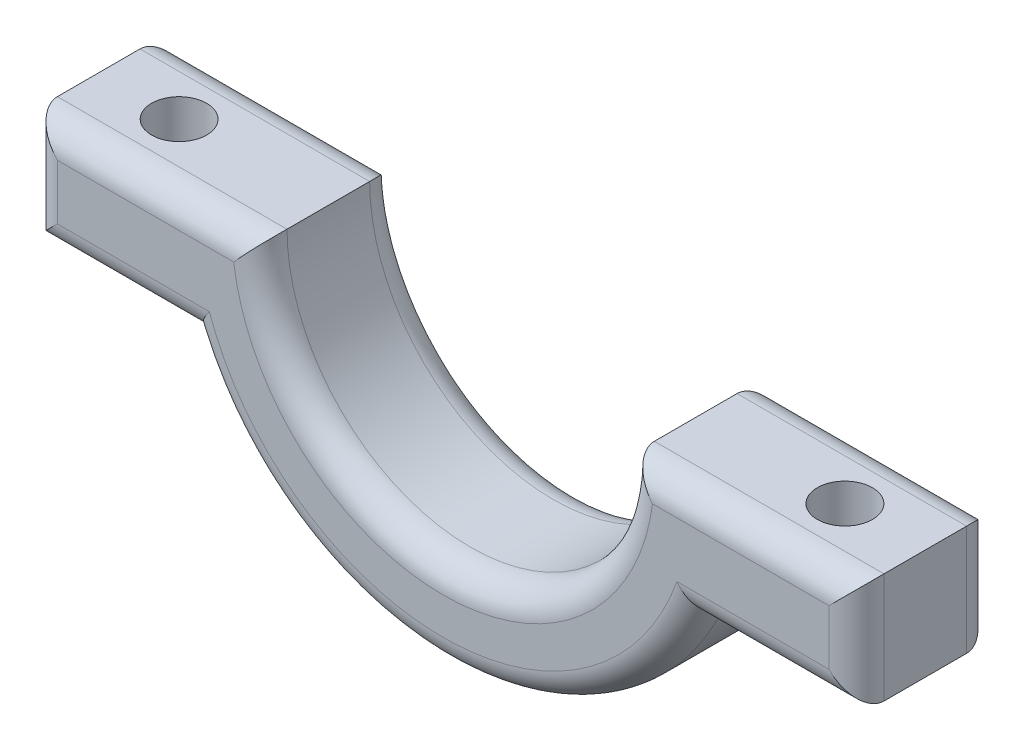
ISO-10303-21;
HEADER;
FILE_DESCRIPTION(('STEP AP214'),'2;1');
FILE_NAME('part.step','',(''),(''),'','','');
FILE_SCHEMA(('AUTOMOTIVE_DESIGN { 1 0 10303 214 1 1 1 1 }'));
ENDSEC;
DATA;
#1=APPLICATION_CONTEXT('core data for automotive mechanical design processes');
#2=APPLICATION_PROTOCOL_DEFINITION('international standard','automotive_design',2000,#1);
#3=PRODUCT_CONTEXT('',#1,'mechanical');
#4=PRODUCT('Part','Part','',(#3));
#5=PRODUCT_RELATED_PRODUCT_CATEGORY('part','',(#4));
#6=PRODUCT_DEFINITION_FORMATION('','',#4);
#7=PRODUCT_DEFINITION_CONTEXT('part definition',#1,'design');
#8=PRODUCT_DEFINITION('design','',#6,#7);
#9=PRODUCT_DEFINITION_SHAPE('','',#8);
#10=(LENGTH_UNIT() NAMED_UNIT(*) SI_UNIT(.MILLI.,.METRE.));
#11=(NAMED_UNIT(*) PLANE_ANGLE_UNIT() SI_UNIT($,.RADIAN.));
#12=(NAMED_UNIT(*) SI_UNIT($,.STERADIAN.) SOLID_ANGLE_UNIT());
#13=UNCERTAINTY_MEASURE_WITH_UNIT(LENGTH_MEASURE(1.E-05),#10,'distance_accuracy_value','');
#14=(GEOMETRIC_REPRESENTATION_CONTEXT(3) GLOBAL_UNCERTAINTY_ASSIGNED_CONTEXT((#13)) GLOBAL_UNIT_ASSIGNED_CONTEXT((#10,
#11,#12)) REPRESENTATION_CONTEXT('',''));
#15=CARTESIAN_POINT('',(0.,0.,0.));
#16=DIRECTION('',(0.,0.,1.));
#17=DIRECTION('',(1.,0.,0.));
#18=AXIS2_PLACEMENT_3D('',#15,#16,#17);
#19=CARTESIAN_POINT('',(0.,0.,7.5));
#20=DIRECTION('',(0.,0.,-1.));
#21=DIRECTION('',(-1.,0.,0.));
#22=AXIS2_PLACEMENT_3D('',#19,#20,#21);
#23=CYLINDRICAL_SURFACE('',#22,20.);
#24=DIRECTION('',(0.,0.,-1.));
#25=VECTOR('',#24,1.);
#26=CARTESIAN_POINT('',(20.,0.,7.5));
#27=LINE('',#26,#25);
#28=CARTESIAN_POINT('',(20.,0.,4.5));
#29=VERTEX_POINT('',#28);
#30=CARTESIAN_POINT('',(20.,0.,-4.5));
#31=VERTEX_POINT('',#30);
#32=EDGE_CURVE('E362',#29,#31,#27,.T.);
#33=ORIENTED_EDGE('',*,*,#32,.T.);
#34=CARTESIAN_POINT('',(0.,0.,-4.5));
#35=DIRECTION('',(0.,0.,-1.));
#36=DIRECTION('',(-1.,0.,0.));
#37=AXIS2_PLACEMENT_3D('',#34,#35,#36);
#38=CIRCLE('',#37,20.);
#39=CARTESIAN_POINT('',(-20.,0.,-4.5));
#40=VERTEX_POINT('',#39);
#41=EDGE_CURVE('E268',#31,#40,#38,.T.);
#42=ORIENTED_EDGE('',*,*,#41,.T.);
#43=DIRECTION('',(0.,0.,-1.));
#44=VECTOR('',#43,1.);
#45=CARTESIAN_POINT('',(-20.,0.,7.5));
#46=LINE('',#45,#44);
#47=CARTESIAN_POINT('',(-20.,0.,4.5));
#48=VERTEX_POINT('',#47);
#49=EDGE_CURVE('E183',#48,#40,#46,.T.);
#50=ORIENTED_EDGE('',*,*,#49,.F.);
#51=CARTESIAN_POINT('',(0.,0.,4.5));
#52=DIRECTION('',(0.,0.,-1.));
#53=DIRECTION('',(-1.,0.,0.));
#54=AXIS2_PLACEMENT_3D('',#51,#52,#53);
#55=CIRCLE('',#54,20.);
#56=EDGE_CURVE('E265',#48,#29,#55,.F.);
#57=ORIENTED_EDGE('',*,*,#56,.T.);
#58=EDGE_LOOP('',(#33,#42,#50,#57));
#59=FACE_BOUND('',#58,.T.);
#60=ADVANCED_FACE('F38',(#59),#23,.F.);
#61=CARTESIAN_POINT('',(-20.,0.,7.5));
#62=DIRECTION('',(0.,-1.,0.));
#63=DIRECTION('',(1.,0.,0.));
#64=AXIS2_PLACEMENT_3D('',#61,#62,#63);
#65=PLANE('',#64);
#66=CARTESIAN_POINT('',(-36.2477270848675,0.,0.));
#67=DIRECTION('',(0.,-1.,0.));
#68=DIRECTION('',(0.,0.,-1.));
#69=AXIS2_PLACEMENT_3D('',#66,#67,#68);
#70=CIRCLE('',#69,3.);
#71=CARTESIAN_POINT('',(-36.2477270848675,0.,-2.99999999999999));
#72=VERTEX_POINT('',#71);
#73=EDGE_CURVE('E465',#72,#72,#70,.T.);
#74=ORIENTED_EDGE('',*,*,#73,.T.);
#75=EDGE_LOOP('',(#74));
#76=FACE_BOUND('',#75,.T.);
#77=ORIENTED_EDGE('',*,*,#49,.T.);
#78=DIRECTION('',(-1.,0.,0.));
#79=VECTOR('',#78,1.);
#80=CARTESIAN_POINT('',(-45.,0.,-4.5));
#81=LINE('',#80,#79);
#82=CARTESIAN_POINT('',(-45.,0.,-4.5));
#83=VERTEX_POINT('',#82);
#84=EDGE_CURVE('E181',#40,#83,#81,.T.);
#85=ORIENTED_EDGE('',*,*,#84,.T.);
#86=DIRECTION('',(0.,0.,-1.));
#87=VECTOR('',#86,1.);
#88=CARTESIAN_POINT('',(-45.,0.,7.5));
#89=LINE('',#88,#87);
#90=CARTESIAN_POINT('',(-45.,0.,4.5));
#91=VERTEX_POINT('',#90);
#92=EDGE_CURVE('E162',#91,#83,#89,.T.);
#93=ORIENTED_EDGE('',*,*,#92,.F.);
#94=DIRECTION('',(-1.,0.,0.));
#95=VECTOR('',#94,1.);
#96=CARTESIAN_POINT('',(-20.,0.,4.5));
#97=LINE('',#96,#95);
#98=EDGE_CURVE('E178',#91,#48,#97,.F.);
#99=ORIENTED_EDGE('',*,*,#98,.T.);
#100=EDGE_LOOP('',(#77,#85,#93,#99));
#101=FACE_BOUND('',#100,.T.);
#102=ADVANCED_FACE('F176',(#76,#101),#65,.F.);
#103=CARTESIAN_POINT('',(-45.,0.,7.5));
#104=DIRECTION('',(1.,0.,0.));
#105=DIRECTION('',(0.,0.,-1.));
#106=AXIS2_PLACEMENT_3D('',#103,#104,#105);
#107=PLANE('',#106);
#108=ORIENTED_EDGE('',*,*,#92,.T.);
#109=DIRECTION('',(0.,-1.,0.));
#110=VECTOR('',#109,1.);
#111=CARTESIAN_POINT('',(-45.,-12.,-4.5));
#112=LINE('',#111,#110);
#113=CARTESIAN_POINT('',(-45.,-12.,-4.5));
#114=VERTEX_POINT('',#113);
#115=EDGE_CURVE('E170',#83,#114,#112,.T.);
#116=ORIENTED_EDGE('',*,*,#115,.T.);
#117=DIRECTION('',(0.,0.,-1.));
#118=VECTOR('',#117,1.);
#119=CARTESIAN_POINT('',(-45.,-12.,7.5));
#120=LINE('',#119,#118);
#121=CARTESIAN_POINT('',(-45.,-12.,4.5));
#122=VERTEX_POINT('',#121);
#123=EDGE_CURVE('E164',#122,#114,#120,.T.);
#124=ORIENTED_EDGE('',*,*,#123,.F.);
#125=DIRECTION('',(0.,-1.,0.));
#126=VECTOR('',#125,1.);
#127=CARTESIAN_POINT('',(-45.,0.,4.5));
#128=LINE('',#127,#126);
#129=EDGE_CURVE('E159',#122,#91,#128,.F.);
#130=ORIENTED_EDGE('',*,*,#129,.T.);
#131=EDGE_LOOP('',(#108,#116,#124,#130));
#132=FACE_BOUND('',#131,.T.);
#133=ADVANCED_FACE('F161',(#132),#107,.F.);
#134=CARTESIAN_POINT('',(-45.,-12.,7.5));
#135=DIRECTION('',(0.,1.,0.));
#136=DIRECTION('',(-1.,0.,0.));
#137=AXIS2_PLACEMENT_3D('',#134,#135,#136);
#138=PLANE('',#137);
#139=CARTESIAN_POINT('',(-36.2477270848675,-12.,0.));
#140=DIRECTION('',(0.,-1.,0.));
#141=DIRECTION('',(0.,0.,-1.));
#142=AXIS2_PLACEMENT_3D('',#139,#140,#141);
#143=CIRCLE('',#142,2.99999999999999);
#144=CARTESIAN_POINT('',(-36.2477270848675,-12.,-2.99999999999998));
#145=VERTEX_POINT('',#144);
#146=EDGE_CURVE('E468',#145,#145,#143,.T.);
#147=ORIENTED_EDGE('',*,*,#146,.F.);
#148=EDGE_LOOP('',(#147));
#149=FACE_BOUND('',#148,.T.);
#150=ORIENTED_EDGE('',*,*,#123,.T.);
#151=DIRECTION('',(1.,0.,0.));
#152=VECTOR('',#151,1.);
#153=CARTESIAN_POINT('',(-27.495454169735,-12.,-4.5));
#154=LINE('',#153,#152);
#155=CARTESIAN_POINT('',(-27.495454169735,-12.,-4.5));
#156=VERTEX_POINT('',#155);
#157=EDGE_CURVE('E237',#114,#156,#154,.T.);
#158=ORIENTED_EDGE('',*,*,#157,.T.);
#159=DIRECTION('',(0.,0.,-1.));
#160=VECTOR('',#159,1.);
#161=CARTESIAN_POINT('',(-27.495454169735,-12.,7.5));
#162=LINE('',#161,#160);
#163=CARTESIAN_POINT('',(-27.495454169735,-12.,4.5));
#164=VERTEX_POINT('',#163);
#165=EDGE_CURVE('E495',#164,#156,#162,.T.);
#166=ORIENTED_EDGE('',*,*,#165,.F.);
#167=DIRECTION('',(1.,0.,0.));
#168=VECTOR('',#167,1.);
#169=CARTESIAN_POINT('',(-45.,-12.,4.5));
#170=LINE('',#169,#168);
#171=EDGE_CURVE('E234',#164,#122,#170,.F.);
#172=ORIENTED_EDGE('',*,*,#171,.T.);
#173=EDGE_LOOP('',(#150,#158,#166,#172));
#174=FACE_BOUND('',#173,.T.);
#175=ADVANCED_FACE('F426',(#149,#174),#138,.F.);
#176=CARTESIAN_POINT('',(0.,0.,7.5));
#177=DIRECTION('',(0.,0.,-1.));
#178=DIRECTION('',(-1.,0.,0.));
#179=AXIS2_PLACEMENT_3D('',#176,#177,#178);
#180=CYLINDRICAL_SURFACE('',#179,30.);
#181=ORIENTED_EDGE('',*,*,#165,.T.);
#182=CARTESIAN_POINT('',(0.,0.,-4.5));
#183=DIRECTION('',(0.,0.,-1.));
#184=DIRECTION('',(-1.,0.,0.));
#185=AXIS2_PLACEMENT_3D('',#182,#183,#184);
#186=CIRCLE('',#185,30.);
#187=CARTESIAN_POINT('',(27.495454169735,-12.,-4.5));
#188=VERTEX_POINT('',#187);
#189=EDGE_CURVE('E243',#156,#188,#186,.F.);
#190=ORIENTED_EDGE('',*,*,#189,.T.);
#191=DIRECTION('',(0.,0.,-1.));
#192=VECTOR('',#191,1.);
#193=CARTESIAN_POINT('',(27.495454169735,-12.,7.5));
#194=LINE('',#193,#192);
#195=CARTESIAN_POINT('',(27.495454169735,-12.,4.5));
#196=VERTEX_POINT('',#195);
#197=EDGE_CURVE('E491',#196,#188,#194,.T.);
#198=ORIENTED_EDGE('',*,*,#197,.F.);
#199=CARTESIAN_POINT('',(0.,0.,4.5));
#200=DIRECTION('',(0.,0.,-1.));
#201=DIRECTION('',(-1.,0.,0.));
#202=AXIS2_PLACEMENT_3D('',#199,#200,#201);
#203=CIRCLE('',#202,30.);
#204=EDGE_CURVE('E240',#196,#164,#203,.T.);
#205=ORIENTED_EDGE('',*,*,#204,.T.);
#206=EDGE_LOOP('',(#181,#190,#198,#205));
#207=FACE_BOUND('',#206,.T.);
#208=ADVANCED_FACE('F429',(#207),#180,.T.);
#209=CARTESIAN_POINT('',(45.,-12.,7.5));
#210=DIRECTION('',(0.,1.,0.));
#211=DIRECTION('',(-1.,0.,0.));
#212=AXIS2_PLACEMENT_3D('',#209,#210,#211);
#213=PLANE('',#212);
#214=CARTESIAN_POINT('',(36.2477270848675,-12.,0.));
#215=DIRECTION('',(0.,-1.,0.));
#216=DIRECTION('',(0.,0.,-1.));
#217=AXIS2_PLACEMENT_3D('',#214,#215,#216);
#218=CIRCLE('',#217,2.99999999999999);
#219=CARTESIAN_POINT('',(36.2477270848675,-12.,-2.99999999999998));
#220=VERTEX_POINT('',#219);
#221=EDGE_CURVE('E472',#220,#220,#218,.T.);
#222=ORIENTED_EDGE('',*,*,#221,.F.);
#223=EDGE_LOOP('',(#222));
#224=FACE_BOUND('',#223,.T.);
#225=ORIENTED_EDGE('',*,*,#197,.T.);
#226=DIRECTION('',(1.,0.,0.));
#227=VECTOR('',#226,1.);
#228=CARTESIAN_POINT('',(45.,-12.,-4.5));
#229=LINE('',#228,#227);
#230=CARTESIAN_POINT('',(45.,-12.,-4.5));
#231=VERTEX_POINT('',#230);
#232=EDGE_CURVE('E249',#188,#231,#229,.T.);
#233=ORIENTED_EDGE('',*,*,#232,.T.);
#234=DIRECTION('',(0.,0.,-1.));
#235=VECTOR('',#234,1.);
#236=CARTESIAN_POINT('',(45.,-12.,7.5));
#237=LINE('',#236,#235);
#238=CARTESIAN_POINT('',(45.,-12.,4.5));
#239=VERTEX_POINT('',#238);
#240=EDGE_CURVE('E487',#239,#231,#237,.T.);
#241=ORIENTED_EDGE('',*,*,#240,.F.);
#242=DIRECTION('',(1.,0.,0.));
#243=VECTOR('',#242,1.);
#244=CARTESIAN_POINT('',(45.,-12.,4.5));
#245=LINE('',#244,#243);
#246=EDGE_CURVE('E246',#239,#196,#245,.F.);
#247=ORIENTED_EDGE('',*,*,#246,.T.);
#248=EDGE_LOOP('',(#225,#233,#241,#247));
#249=FACE_BOUND('',#248,.T.);
#250=ADVANCED_FACE('F433',(#224,#249),#213,.F.);
#251=CARTESIAN_POINT('',(45.,0.,7.5));
#252=DIRECTION('',(-1.,0.,0.));
#253=DIRECTION('',(0.,-1.,0.));
#254=AXIS2_PLACEMENT_3D('',#251,#252,#253);
#255=PLANE('',#254);
#256=ORIENTED_EDGE('',*,*,#240,.T.);
#257=DIRECTION('',(0.,1.,0.));
#258=VECTOR('',#257,1.);
#259=CARTESIAN_POINT('',(45.,0.,-4.5));
#260=LINE('',#259,#258);
#261=CARTESIAN_POINT('',(45.,0.,-4.5));
#262=VERTEX_POINT('',#261);
#263=EDGE_CURVE('E255',#231,#262,#260,.T.);
#264=ORIENTED_EDGE('',*,*,#263,.T.);
#265=DIRECTION('',(0.,0.,-1.));
#266=VECTOR('',#265,1.);
#267=CARTESIAN_POINT('',(45.,0.,7.5));
#268=LINE('',#267,#266);
#269=CARTESIAN_POINT('',(45.,0.,4.5));
#270=VERTEX_POINT('',#269);
#271=EDGE_CURVE('E483',#270,#262,#268,.T.);
#272=ORIENTED_EDGE('',*,*,#271,.F.);
#273=DIRECTION('',(0.,1.,0.));
#274=VECTOR('',#273,1.);
#275=CARTESIAN_POINT('',(45.,0.,4.5));
#276=LINE('',#275,#274);
#277=EDGE_CURVE('E252',#270,#239,#276,.F.);
#278=ORIENTED_EDGE('',*,*,#277,.T.);
#279=EDGE_LOOP('',(#256,#264,#272,#278));
#280=FACE_BOUND('',#279,.T.);
#281=ADVANCED_FACE('F437',(#280),#255,.F.);
#282=CARTESIAN_POINT('',(20.,0.,7.5));
#283=DIRECTION('',(0.,-1.,0.));
#284=DIRECTION('',(0.,0.,-1.));
#285=AXIS2_PLACEMENT_3D('',#282,#283,#284);
#286=PLANE('',#285);
#287=CARTESIAN_POINT('',(36.2477270848675,0.,0.));
#288=DIRECTION('',(0.,-1.,0.));
#289=DIRECTION('',(0.,0.,-1.));
#290=AXIS2_PLACEMENT_3D('',#287,#288,#289);
#291=CIRCLE('',#290,3.);
#292=CARTESIAN_POINT('',(36.2477270848675,0.,-2.99999999999999));
#293=VERTEX_POINT('',#292);
#294=EDGE_CURVE('E373',#293,#293,#291,.T.);
#295=ORIENTED_EDGE('',*,*,#294,.T.);
#296=EDGE_LOOP('',(#295));
#297=FACE_BOUND('',#296,.T.);
#298=ORIENTED_EDGE('',*,*,#271,.T.);
#299=DIRECTION('',(-1.,0.,0.));
#300=VECTOR('',#299,1.);
#301=CARTESIAN_POINT('',(20.,0.,-4.5));
#302=LINE('',#301,#300);
#303=EDGE_CURVE('E262',#262,#31,#302,.T.);
#304=ORIENTED_EDGE('',*,*,#303,.T.);
#305=ORIENTED_EDGE('',*,*,#32,.F.);
#306=DIRECTION('',(-1.,0.,0.));
#307=VECTOR('',#306,1.);
#308=CARTESIAN_POINT('',(20.,0.,4.5));
#309=LINE('',#308,#307);
#310=EDGE_CURVE('E258',#29,#270,#309,.F.);
#311=ORIENTED_EDGE('',*,*,#310,.T.);
#312=EDGE_LOOP('',(#298,#304,#305,#311));
#313=FACE_BOUND('',#312,.T.);
#314=ADVANCED_FACE('F441',(#297,#313),#286,.F.);
#315=CARTESIAN_POINT('',(0.,0.,7.5));
#316=DIRECTION('',(0.,0.,-1.));
#317=DIRECTION('',(-1.,0.,0.));
#318=AXIS2_PLACEMENT_3D('',#315,#316,#317);
#319=PLANE('',#318);
#320=DIRECTION('',(0.,1.,0.));
#321=VECTOR('',#320,1.);
#322=CARTESIAN_POINT('',(42.,1.45716771982052E-13,7.5));
#323=LINE('',#322,#321);
#324=CARTESIAN_POINT('',(42.,-9.,7.5));
#325=VERTEX_POINT('',#324);
#326=CARTESIAN_POINT('',(42.,-3.,7.5));
#327=VERTEX_POINT('',#326);
#328=EDGE_CURVE('E54',#325,#327,#323,.T.);
#329=ORIENTED_EDGE('',*,*,#328,.T.);
#330=DIRECTION('',(-1.,0.,0.));
#331=VECTOR('',#330,1.);
#332=CARTESIAN_POINT('',(0.,-3.,7.5));
#333=LINE('',#332,#331);
#334=CARTESIAN_POINT('',(22.8035085019828,-3.,7.5));
#335=VERTEX_POINT('',#334);
#336=EDGE_CURVE('E11',#327,#335,#333,.T.);
#337=ORIENTED_EDGE('',*,*,#336,.T.);
#338=CARTESIAN_POINT('',(0.,0.,7.5));
#339=DIRECTION('',(0.,0.,-1.));
#340=DIRECTION('',(-1.,0.,0.));
#341=AXIS2_PLACEMENT_3D('',#338,#339,#340);
#342=CIRCLE('',#341,23.);
#343=CARTESIAN_POINT('',(-22.8035085019828,-3.,7.5));
#344=VERTEX_POINT('',#343);
#345=EDGE_CURVE('E271',#335,#344,#342,.T.);
#346=ORIENTED_EDGE('',*,*,#345,.T.);
#347=DIRECTION('',(-1.,0.,0.));
#348=VECTOR('',#347,1.);
#349=CARTESIAN_POINT('',(0.,-3.,7.5));
#350=LINE('',#349,#348);
#351=CARTESIAN_POINT('',(-42.,-3.,7.5));
#352=VERTEX_POINT('',#351);
#353=EDGE_CURVE('E274',#344,#352,#350,.T.);
#354=ORIENTED_EDGE('',*,*,#353,.T.);
#355=DIRECTION('',(0.,-1.,0.));
#356=VECTOR('',#355,1.);
#357=CARTESIAN_POINT('',(-42.,0.,7.5));
#358=LINE('',#357,#356);
#359=CARTESIAN_POINT('',(-42.,-9.00000000000001,7.5));
#360=VERTEX_POINT('',#359);
#361=EDGE_CURVE('E189',#352,#360,#358,.T.);
#362=ORIENTED_EDGE('',*,*,#361,.T.);
#363=DIRECTION('',(1.,0.,0.));
#364=VECTOR('',#363,1.);
#365=CARTESIAN_POINT('',(0.,-9.00000000000001,7.5));
#366=LINE('',#365,#364);
#367=CARTESIAN_POINT('',(-25.4558441227157,-9.00000000000001,7.5));
#368=VERTEX_POINT('',#367);
#369=EDGE_CURVE('E279',#360,#368,#366,.T.);
#370=ORIENTED_EDGE('',*,*,#369,.T.);
#371=CARTESIAN_POINT('',(0.,0.,7.5));
#372=DIRECTION('',(0.,0.,-1.));
#373=DIRECTION('',(-1.,0.,0.));
#374=AXIS2_PLACEMENT_3D('',#371,#372,#373);
#375=CIRCLE('',#374,27.);
#376=CARTESIAN_POINT('',(25.4558441227157,-9.,7.5));
#377=VERTEX_POINT('',#376);
#378=EDGE_CURVE('E282',#368,#377,#375,.F.);
#379=ORIENTED_EDGE('',*,*,#378,.T.);
#380=DIRECTION('',(1.,0.,0.));
#381=VECTOR('',#380,1.);
#382=CARTESIAN_POINT('',(0.,-9.00000000000001,7.5));
#383=LINE('',#382,#381);
#384=EDGE_CURVE('E65',#377,#325,#383,.T.);
#385=ORIENTED_EDGE('',*,*,#384,.T.);
#386=EDGE_LOOP('',(#329,#337,#346,#354,#362,#370,#379,#385));
#387=FACE_BOUND('',#386,.T.);
#388=ADVANCED_FACE('F445',(#387),#319,.F.);
#389=CARTESIAN_POINT('',(0.,0.,-7.5));
#390=DIRECTION('',(0.,0.,-1.));
#391=DIRECTION('',(-1.,0.,0.));
#392=AXIS2_PLACEMENT_3D('',#389,#390,#391);
#393=PLANE('',#392);
#394=DIRECTION('',(0.,-1.,0.));
#395=VECTOR('',#394,1.);
#396=CARTESIAN_POINT('',(-42.,0.,-7.5));
#397=LINE('',#396,#395);
#398=CARTESIAN_POINT('',(-42.,-9.00000000000001,-7.5));
#399=VERTEX_POINT('',#398);
#400=CARTESIAN_POINT('',(-42.,-3.,-7.5));
#401=VERTEX_POINT('',#400);
#402=EDGE_CURVE('E226',#399,#401,#397,.F.);
#403=ORIENTED_EDGE('',*,*,#402,.T.);
#404=DIRECTION('',(-1.,0.,0.));
#405=VECTOR('',#404,1.);
#406=CARTESIAN_POINT('',(-20.,-3.,-7.5));
#407=LINE('',#406,#405);
#408=CARTESIAN_POINT('',(-22.8035085019828,-3.,-7.5));
#409=VERTEX_POINT('',#408);
#410=EDGE_CURVE('E171',#401,#409,#407,.F.);
#411=ORIENTED_EDGE('',*,*,#410,.T.);
#412=CARTESIAN_POINT('',(0.,0.,-7.5));
#413=DIRECTION('',(0.,0.,-1.));
#414=DIRECTION('',(-1.,0.,0.));
#415=AXIS2_PLACEMENT_3D('',#412,#413,#414);
#416=CIRCLE('',#415,23.);
#417=CARTESIAN_POINT('',(22.8035085019828,-3.,-7.5));
#418=VERTEX_POINT('',#417);
#419=EDGE_CURVE('E205',#409,#418,#416,.F.);
#420=ORIENTED_EDGE('',*,*,#419,.T.);
#421=DIRECTION('',(-1.,0.,0.));
#422=VECTOR('',#421,1.);
#423=CARTESIAN_POINT('',(45.,-3.,-7.5));
#424=LINE('',#423,#422);
#425=CARTESIAN_POINT('',(42.,-3.,-7.5));
#426=VERTEX_POINT('',#425);
#427=EDGE_CURVE('E211',#418,#426,#424,.F.);
#428=ORIENTED_EDGE('',*,*,#427,.T.);
#429=DIRECTION('',(0.,1.,0.));
#430=VECTOR('',#429,1.);
#431=CARTESIAN_POINT('',(42.,-12.,-7.5));
#432=LINE('',#431,#430);
#433=CARTESIAN_POINT('',(42.,-9.,-7.5));
#434=VERTEX_POINT('',#433);
#435=EDGE_CURVE('E214',#426,#434,#432,.F.);
#436=ORIENTED_EDGE('',*,*,#435,.T.);
#437=DIRECTION('',(1.,0.,0.));
#438=VECTOR('',#437,1.);
#439=CARTESIAN_POINT('',(27.495454169735,-9.,-7.5));
#440=LINE('',#439,#438);
#441=CARTESIAN_POINT('',(25.4558441227157,-9.,-7.5));
#442=VERTEX_POINT('',#441);
#443=EDGE_CURVE('E217',#434,#442,#440,.F.);
#444=ORIENTED_EDGE('',*,*,#443,.T.);
#445=CARTESIAN_POINT('',(0.,0.,-7.5));
#446=DIRECTION('',(0.,0.,-1.));
#447=DIRECTION('',(-1.,0.,0.));
#448=AXIS2_PLACEMENT_3D('',#445,#446,#447);
#449=CIRCLE('',#448,27.);
#450=CARTESIAN_POINT('',(-25.4558441227157,-9.00000000000001,-7.5));
#451=VERTEX_POINT('',#450);
#452=EDGE_CURVE('E220',#442,#451,#449,.T.);
#453=ORIENTED_EDGE('',*,*,#452,.T.);
#454=DIRECTION('',(1.,0.,0.));
#455=VECTOR('',#454,1.);
#456=CARTESIAN_POINT('',(-45.,-9.00000000000001,-7.5));
#457=LINE('',#456,#455);
#458=EDGE_CURVE('E223',#451,#399,#457,.F.);
#459=ORIENTED_EDGE('',*,*,#458,.T.);
#460=EDGE_LOOP('',(#403,#411,#420,#428,#436,#444,#453,#459));
#461=FACE_BOUND('',#460,.T.);
#462=ADVANCED_FACE('F447',(#461),#393,.T.);
#463=CARTESIAN_POINT('',(45.,-9.,-4.5));
#464=DIRECTION('',(-1.,0.,0.));
#465=DIRECTION('',(0.,-1.,0.));
#466=AXIS2_PLACEMENT_3D('',#463,#464,#465);
#467=CYLINDRICAL_SURFACE('',#466,3.);
#468=CARTESIAN_POINT('',(27.495454169735,-12.,-4.5));
#469=CARTESIAN_POINT('',(27.4954624226908,-12.0000137389739,-4.57442648283751));
#470=CARTESIAN_POINT('',(27.4936412391747,-11.9972307298979,-4.64884493608154));
#471=CARTESIAN_POINT('',(27.4864034191014,-11.9861763620367,-4.79706939372933));
#472=CARTESIAN_POINT('',(27.4809881580715,-11.9779071029526,-4.87087562150693));
#473=CARTESIAN_POINT('',(27.4666600436842,-11.95603793698,-5.01698492877858));
#474=CARTESIAN_POINT('',(27.4577641329796,-11.9424638525983,-5.08929352947464));
#475=CARTESIAN_POINT('',(27.4365988237759,-11.9101900977576,-5.23223654520358));
#476=CARTESIAN_POINT('',(27.4243292460467,-11.8914901549815,-5.30287087107203));
#477=CARTESIAN_POINT('',(27.3827021267674,-11.8280999611043,-5.51137441246792));
#478=CARTESIAN_POINT('',(27.3484960841419,-11.7760732296747,-5.64614425798936));
#479=CARTESIAN_POINT('',(27.2686680175326,-11.6549630832167,-5.90411939480984));
#480=CARTESIAN_POINT('',(27.2230346033563,-11.5858626509567,-6.02731297800664));
#481=CARTESIAN_POINT('',(27.1191023804091,-11.4289685187125,-6.26685341146228));
#482=CARTESIAN_POINT('',(27.0602217987173,-11.3403220624562,-6.38238674494806));
#483=CARTESIAN_POINT('',(26.9335479251577,-11.1503330622549,-6.59681123484872));
#484=CARTESIAN_POINT('',(26.8657529443653,-11.0489881126211,-6.69569922951729));
#485=CARTESIAN_POINT('',(26.7120128819171,-10.820135147409,-6.89018608911513));
#486=CARTESIAN_POINT('',(26.6248807183076,-10.6910019007648,-6.98293063647241));
#487=CARTESIAN_POINT('',(26.4434142666751,-10.4234971624521,-7.14541175643963));
#488=CARTESIAN_POINT('',(26.3490700965393,-10.2851130287187,-7.21511603669175));
#489=CARTESIAN_POINT('',(26.1265171368068,-9.96053211402714,-7.348977300974));
#490=CARTESIAN_POINT('',(25.9965597291628,-9.77232180354273,-7.40536540323104));
#491=CARTESIAN_POINT('',(25.7320195739508,-9.39220481765698,-7.48053962276651));
#492=CARTESIAN_POINT('',(25.5974463450748,-9.20030607025346,-7.49939888676341));
#493=CARTESIAN_POINT('',(25.4601862534248,-9.0061410892783,-7.49999528916834));
#494=CARTESIAN_POINT('',(25.4580152507194,-9.00307043487181,-7.50000000304728));
#495=CARTESIAN_POINT('',(25.4558441227157,-9.,-7.5));
#496=B_SPLINE_CURVE_WITH_KNOTS('',3,(#468,#469,#470,#471,#472,#473,#474,#475,#476,#477,#478,
#479,#480,#481,#482,#483,#484,#485,#486,#487,#488,#489,#490,#491,#492,#493,#494,#495),
.UNSPECIFIED.,.F.,.F.,(4,2,2,2,2,2,2,2,2,2,2,2,2,4),(0.,0.223191801539036,0.446298232200578,
0.66833190145675,0.890377368791976,1.33356482372712,1.77719579485759,2.24659896015158,
2.71609118719679,3.25792087908314,3.80050679016691,4.50392599895871,5.2059728391034,
5.21725465726855),.UNSPECIFIED.);
#497=EDGE_CURVE('E349',#442,#188,#496,.F.);
#498=ORIENTED_EDGE('',*,*,#497,.F.);
#499=ORIENTED_EDGE('',*,*,#443,.F.);
#500=CARTESIAN_POINT('',(42.,-9.,-4.5));
#501=DIRECTION('',(-0.707106781186546,-0.707106781186549,0.));
#502=DIRECTION('',(0.707106781186549,-0.707106781186546,0.));
#503=AXIS2_PLACEMENT_3D('',#500,#501,#502);
#504=ELLIPSE('',#503,4.24264068711929,3.);
#505=EDGE_CURVE('E357',#231,#434,#504,.F.);
#506=ORIENTED_EDGE('',*,*,#505,.F.);
#507=ORIENTED_EDGE('',*,*,#232,.F.);
#508=EDGE_LOOP('',(#498,#499,#506,#507));
#509=FACE_BOUND('',#508,.T.);
#510=ADVANCED_FACE('F344',(#509),#467,.T.);
#511=CARTESIAN_POINT('',(42.,0.,-4.5));
#512=DIRECTION('',(0.,-1.,0.));
#513=DIRECTION('',(1.,0.,0.));
#514=AXIS2_PLACEMENT_3D('',#511,#512,#513);
#515=CYLINDRICAL_SURFACE('',#514,3.);
#516=ORIENTED_EDGE('',*,*,#505,.T.);
#517=ORIENTED_EDGE('',*,*,#435,.F.);
#518=CARTESIAN_POINT('',(42.,-3.,-4.5));
#519=DIRECTION('',(0.707106781186549,-0.707106781186546,0.));
#520=DIRECTION('',(0.707106781186546,0.707106781186549,0.));
#521=AXIS2_PLACEMENT_3D('',#518,#519,#520);
#522=ELLIPSE('',#521,4.24264068711928,3.);
#523=EDGE_CURVE('E358',#262,#426,#522,.F.);
#524=ORIENTED_EDGE('',*,*,#523,.F.);
#525=ORIENTED_EDGE('',*,*,#263,.F.);
#526=EDGE_LOOP('',(#516,#517,#524,#525));
#527=FACE_BOUND('',#526,.T.);
#528=ADVANCED_FACE('F342',(#527),#515,.T.);
#529=CARTESIAN_POINT('',(0.,0.,-4.5));
#530=DIRECTION('',(0.,0.,-1.));
#531=DIRECTION('',(-1.,0.,0.));
#532=AXIS2_PLACEMENT_3D('',#529,#530,#531);
#533=TOROIDAL_SURFACE('',#532,27.,3.);
#534=ORIENTED_EDGE('',*,*,#497,.T.);
#535=ORIENTED_EDGE('',*,*,#189,.F.);
#536=CARTESIAN_POINT('',(-27.495454169735,-12.,-4.5));
#537=CARTESIAN_POINT('',(-27.4954624226908,-12.0000137389739,-4.57442648283751));
#538=CARTESIAN_POINT('',(-27.4936412391747,-11.9972307298979,-4.64884493608154));
#539=CARTESIAN_POINT('',(-27.4864034191014,-11.9861763620367,-4.79706939372933));
#540=CARTESIAN_POINT('',(-27.4809881580715,-11.9779071029526,-4.87087562150693));
#541=CARTESIAN_POINT('',(-27.4666600436842,-11.95603793698,-5.01698492877858));
#542=CARTESIAN_POINT('',(-27.4577641329796,-11.9424638525983,-5.08929352947464));
#543=CARTESIAN_POINT('',(-27.4365988237759,-11.9101900977576,-5.23223654520358));
#544=CARTESIAN_POINT('',(-27.4243292460467,-11.8914901549815,-5.30287087107203));
#545=CARTESIAN_POINT('',(-27.3827021267674,-11.8280999611043,-5.51137441246792));
#546=CARTESIAN_POINT('',(-27.3484960841419,-11.7760732296747,-5.64614425798936));
#547=CARTESIAN_POINT('',(-27.2686680175326,-11.6549630832167,-5.90411939480984));
#548=CARTESIAN_POINT('',(-27.2230346033563,-11.5858626509567,-6.02731297800663));
#549=CARTESIAN_POINT('',(-27.1191023804091,-11.4289685187125,-6.26685341146228));
#550=CARTESIAN_POINT('',(-27.0602217987173,-11.3403220624562,-6.38238674494806));
#551=CARTESIAN_POINT('',(-26.9335479251577,-11.1503330622549,-6.59681123484872));
#552=CARTESIAN_POINT('',(-26.8657529443653,-11.0489881126211,-6.69569922951729));
#553=CARTESIAN_POINT('',(-26.7120128819171,-10.820135147409,-6.89018608911513));
#554=CARTESIAN_POINT('',(-26.6248807183076,-10.6910019007648,-6.98293063647241));
#555=CARTESIAN_POINT('',(-26.4434142666751,-10.4234971624521,-7.14541175643963));
#556=CARTESIAN_POINT('',(-26.3490700965393,-10.2851130287187,-7.21511603669175));
#557=CARTESIAN_POINT('',(-26.1265171368068,-9.96053211402715,-7.348977300974));
#558=CARTESIAN_POINT('',(-25.9965597291627,-9.77232180354275,-7.40536540323104));
#559=CARTESIAN_POINT('',(-25.7320195739508,-9.39220481765697,-7.48053962276651));
#560=CARTESIAN_POINT('',(-25.5974463450749,-9.20030607025342,-7.49939888676343));
#561=CARTESIAN_POINT('',(-25.4601862534248,-9.00614108927831,-7.49999528916834));
#562=CARTESIAN_POINT('',(-25.4580152507194,-9.00307043487182,-7.50000000304728));
#563=CARTESIAN_POINT('',(-25.4558441227157,-9.00000000000001,-7.5));
#564=B_SPLINE_CURVE_WITH_KNOTS('',3,(#536,#537,#538,#539,#540,#541,#542,#543,#544,#545,#546,
#547,#548,#549,#550,#551,#552,#553,#554,#555,#556,#557,#558,#559,#560,#561,#562,#563),
.UNSPECIFIED.,.F.,.F.,(4,2,2,2,2,2,2,2,2,2,2,2,2,4),(0.,0.223191801539036,0.446298232200578,
0.668331901456749,0.890377368791975,1.33356482372712,1.77719579485759,2.24659896015158,
2.71609118719678,3.25792087908314,3.80050679016691,4.5039259989587,5.2059728391034,
5.21725465726855),.UNSPECIFIED.);
#565=EDGE_CURVE('E323',#451,#156,#564,.F.);
#566=ORIENTED_EDGE('',*,*,#565,.F.);
#567=ORIENTED_EDGE('',*,*,#452,.F.);
#568=EDGE_LOOP('',(#534,#535,#566,#567));
#569=FACE_BOUND('',#568,.T.);
#570=ADVANCED_FACE('F334',(#569),#533,.T.);
#571=CARTESIAN_POINT('',(20.,-3.,-4.5));
#572=DIRECTION('',(1.,0.,0.));
#573=DIRECTION('',(0.,0.,-1.));
#574=AXIS2_PLACEMENT_3D('',#571,#572,#573);
#575=CYLINDRICAL_SURFACE('',#574,3.);
#576=ORIENTED_EDGE('',*,*,#523,.T.);
#577=ORIENTED_EDGE('',*,*,#427,.F.);
#578=CARTESIAN_POINT('',(20.,0.,-4.5));
#579=CARTESIAN_POINT('',(19.9999812570638,1.7149763989332E-05,-4.56770411004573));
#580=CARTESIAN_POINT('',(20.002291283702,-0.00229131498315849,-4.63539421101834));
#581=CARTESIAN_POINT('',(20.011424620738,-0.0114269408922414,-4.77010662704989));
#582=CARTESIAN_POINT('',(20.0182441174891,-0.0182502838369316,-4.83712945784386));
#583=CARTESIAN_POINT('',(20.0361726825178,-0.0362035298063108,-4.96939443462834));
#584=CARTESIAN_POINT('',(20.0472431486753,-0.0472946796536434,-5.03464710443539));
#585=CARTESIAN_POINT('',(20.0734198297122,-0.073550293079691,-5.16349152174645));
#586=CARTESIAN_POINT('',(20.0885266831589,-0.0887154011716601,-5.22708300469725));
#587=CARTESIAN_POINT('',(20.1393562967112,-0.13981315289468,-5.41432469497369));
#588=CARTESIAN_POINT('',(20.1806651304425,-0.181424955056805,-5.53498358155616));
#589=CARTESIAN_POINT('',(20.2755253147993,-0.277366861715081,-5.76610578215772));
#590=CARTESIAN_POINT('',(20.3291061209812,-0.331727574174387,-5.87654365307554));
#591=CARTESIAN_POINT('',(20.4705730614115,-0.475938032653888,-6.13048858323304));
#592=CARTESIAN_POINT('',(20.5633886506257,-0.571078132853249,-6.26825331916828));
#593=CARTESIAN_POINT('',(20.7623761167593,-0.776657284250766,-6.52073528234059));
#594=CARTESIAN_POINT('',(20.8685736347033,-0.887125748268262,-6.63540713529233));
#595=CARTESIAN_POINT('',(21.1285535742984,-1.1598400268435,-6.8786228345576));
#596=CARTESIAN_POINT('',(21.2860108050222,-1.32670348826518,-6.99804744732807));
#597=CARTESIAN_POINT('',(21.6098781142373,-1.67401258706762,-7.19851833962201));
#598=CARTESIAN_POINT('',(21.7762949450664,-1.85446851036392,-7.27953520949536));
#599=CARTESIAN_POINT('',(22.0854245084732,-2.19365265469181,-7.39419384878854));
#600=CARTESIAN_POINT('',(22.2275415861,-2.3510819673712,-7.43343093106119));
#601=CARTESIAN_POINT('',(22.5121503958498,-2.66941851264936,-7.48607757342075));
#602=CARTESIAN_POINT('',(22.6546406186809,-2.83031734352515,-7.49954369242421));
#603=CARTESIAN_POINT('',(22.7986721887524,-2.99448619027607,-7.49999619816881));
#604=CARTESIAN_POINT('',(22.8010904763338,-2.99724302374234,-7.49999999855544));
#605=CARTESIAN_POINT('',(22.8035085019828,-3.,-7.5));
#606=B_SPLINE_CURVE_WITH_KNOTS('',3,(#578,#579,#580,#581,#582,#583,#584,#585,#586,#587,#588,
#589,#590,#591,#592,#593,#594,#595,#596,#597,#598,#599,#600,#601,#602,#603,#604,#605),
.UNSPECIFIED.,.F.,.F.,(4,2,2,2,2,2,2,2,2,2,2,2,2,4),(0.,0.203010848749849,0.405850230967721,
0.606889642187986,0.807960877236829,1.20846887869582,1.60994845711129,2.18105452457587,
2.75327201602652,3.5251364377809,4.29759094218777,4.94318353073518,5.5873576204996,
5.59835917208934),.UNSPECIFIED.);
#607=EDGE_CURVE('E315',#31,#418,#606,.T.);
#608=ORIENTED_EDGE('',*,*,#607,.F.);
#609=ORIENTED_EDGE('',*,*,#303,.F.);
#610=EDGE_LOOP('',(#576,#577,#608,#609));
#611=FACE_BOUND('',#610,.T.);
#612=ADVANCED_FACE('F331',(#611),#575,.T.);
#613=CARTESIAN_POINT('',(-45.,-9.00000000000001,-4.5));
#614=DIRECTION('',(-1.,0.,0.));
#615=DIRECTION('',(0.,-1.,0.));
#616=AXIS2_PLACEMENT_3D('',#613,#614,#615);
#617=CYLINDRICAL_SURFACE('',#616,3.);
#618=ORIENTED_EDGE('',*,*,#565,.T.);
#619=ORIENTED_EDGE('',*,*,#157,.F.);
#620=CARTESIAN_POINT('',(-42.,-9.00000000000001,-4.5));
#621=DIRECTION('',(-0.707106781186547,0.707106781186547,0.));
#622=DIRECTION('',(-0.707106781186548,-0.707106781186547,0.));
#623=AXIS2_PLACEMENT_3D('',#620,#621,#622);
#624=ELLIPSE('',#623,4.24264068711928,3.);
#625=EDGE_CURVE('E301',#399,#114,#624,.T.);
#626=ORIENTED_EDGE('',*,*,#625,.F.);
#627=ORIENTED_EDGE('',*,*,#458,.F.);
#628=EDGE_LOOP('',(#618,#619,#626,#627));
#629=FACE_BOUND('',#628,.T.);
#630=ADVANCED_FACE('F311',(#629),#617,.T.);
#631=CARTESIAN_POINT('',(0.,0.,-4.5));
#632=DIRECTION('',(0.,0.,-1.));
#633=DIRECTION('',(-1.,0.,0.));
#634=AXIS2_PLACEMENT_3D('',#631,#632,#633);
#635=TOROIDAL_SURFACE('',#634,23.,3.);
#636=ORIENTED_EDGE('',*,*,#607,.T.);
#637=ORIENTED_EDGE('',*,*,#419,.F.);
#638=CARTESIAN_POINT('',(-20.,0.,-4.5));
#639=CARTESIAN_POINT('',(-19.9999812570638,1.71497639893283E-05,-4.56770411004573));
#640=CARTESIAN_POINT('',(-20.002291283702,-0.0022913149831585,-4.63539421101834));
#641=CARTESIAN_POINT('',(-20.011424620738,-0.0114269408922414,-4.77010662704989));
#642=CARTESIAN_POINT('',(-20.0182441174891,-0.0182502838369316,-4.83712945784386));
#643=CARTESIAN_POINT('',(-20.0361726825178,-0.0362035298063108,-4.96939443462834));
#644=CARTESIAN_POINT('',(-20.0472431486753,-0.0472946796536434,-5.03464710443539));
#645=CARTESIAN_POINT('',(-20.0734198297122,-0.073550293079691,-5.16349152174645));
#646=CARTESIAN_POINT('',(-20.0885266831589,-0.0887154011716601,-5.22708300469725));
#647=CARTESIAN_POINT('',(-20.1393562967112,-0.13981315289468,-5.41432469497369));
#648=CARTESIAN_POINT('',(-20.1806651304425,-0.181424955056805,-5.53498358155616));
#649=CARTESIAN_POINT('',(-20.2755253147993,-0.277366861715081,-5.76610578215772));
#650=CARTESIAN_POINT('',(-20.3291061209812,-0.331727574174388,-5.87654365307554));
#651=CARTESIAN_POINT('',(-20.4705730614115,-0.475938032653888,-6.13048858323304));
#652=CARTESIAN_POINT('',(-20.5633886506257,-0.571078132853249,-6.26825331916828));
#653=CARTESIAN_POINT('',(-20.7623761167593,-0.776657284250765,-6.52073528234059));
#654=CARTESIAN_POINT('',(-20.8685736347033,-0.887125748268262,-6.63540713529233));
#655=CARTESIAN_POINT('',(-21.1285535742984,-1.1598400268435,-6.8786228345576));
#656=CARTESIAN_POINT('',(-21.2860108050222,-1.32670348826518,-6.99804744732807));
#657=CARTESIAN_POINT('',(-21.6098781142373,-1.67401258706762,-7.19851833962201));
#658=CARTESIAN_POINT('',(-21.7762949450664,-1.85446851036392,-7.27953520949536));
#659=CARTESIAN_POINT('',(-22.0854245084732,-2.19365265469181,-7.39419384878854));
#660=CARTESIAN_POINT('',(-22.2275415861,-2.3510819673712,-7.43343093106119));
#661=CARTESIAN_POINT('',(-22.5121503958498,-2.66941851264936,-7.48607757342075));
#662=CARTESIAN_POINT('',(-22.6546406186808,-2.83031734352515,-7.49954369242421));
#663=CARTESIAN_POINT('',(-22.7986721887524,-2.99448619027607,-7.49999619816881));
#664=CARTESIAN_POINT('',(-22.8010904763338,-2.99724302374234,-7.49999999855544));
#665=CARTESIAN_POINT('',(-22.8035085019828,-3.,-7.5));
#666=B_SPLINE_CURVE_WITH_KNOTS('',3,(#638,#639,#640,#641,#642,#643,#644,#645,#646,#647,#648,
#649,#650,#651,#652,#653,#654,#655,#656,#657,#658,#659,#660,#661,#662,#663,#664,#665),
.UNSPECIFIED.,.F.,.F.,(4,2,2,2,2,2,2,2,2,2,2,2,2,4),(0.,0.203010848749849,0.405850230967721,
0.606889642187986,0.807960877236829,1.20846887869582,1.60994845711129,2.18105452457587,
2.75327201602652,3.5251364377809,4.29759094218777,4.94318353073518,5.58735762049961,
5.59835917208934),.UNSPECIFIED.);
#667=EDGE_CURVE('E292',#40,#409,#666,.T.);
#668=ORIENTED_EDGE('',*,*,#667,.F.);
#669=ORIENTED_EDGE('',*,*,#41,.F.);
#670=EDGE_LOOP('',(#636,#637,#668,#669));
#671=FACE_BOUND('',#670,.T.);
#672=ADVANCED_FACE('F306',(#671),#635,.T.);
#673=CARTESIAN_POINT('',(-42.,0.,-4.5));
#674=DIRECTION('',(0.,1.,0.));
#675=DIRECTION('',(0.,0.,1.));
#676=AXIS2_PLACEMENT_3D('',#673,#674,#675);
#677=CYLINDRICAL_SURFACE('',#676,3.);
#678=ORIENTED_EDGE('',*,*,#625,.T.);
#679=ORIENTED_EDGE('',*,*,#115,.F.);
#680=CARTESIAN_POINT('',(-42.,-3.,-4.5));
#681=DIRECTION('',(0.707106781186547,0.707106781186548,0.));
#682=DIRECTION('',(-0.707106781186548,0.707106781186547,0.));
#683=AXIS2_PLACEMENT_3D('',#680,#681,#682);
#684=ELLIPSE('',#683,4.24264068711928,3.);
#685=EDGE_CURVE('E289',#401,#83,#684,.T.);
#686=ORIENTED_EDGE('',*,*,#685,.F.);
#687=ORIENTED_EDGE('',*,*,#402,.F.);
#688=EDGE_LOOP('',(#678,#679,#686,#687));
#689=FACE_BOUND('',#688,.T.);
#690=ADVANCED_FACE('F310',(#689),#677,.T.);
#691=CARTESIAN_POINT('',(-20.,-3.,-4.5));
#692=DIRECTION('',(1.,0.,0.));
#693=DIRECTION('',(0.,1.,0.));
#694=AXIS2_PLACEMENT_3D('',#691,#692,#693);
#695=CYLINDRICAL_SURFACE('',#694,3.);
#696=ORIENTED_EDGE('',*,*,#667,.T.);
#697=ORIENTED_EDGE('',*,*,#410,.F.);
#698=ORIENTED_EDGE('',*,*,#685,.T.);
#699=ORIENTED_EDGE('',*,*,#84,.F.);
#700=EDGE_LOOP('',(#696,#697,#698,#699));
#701=FACE_BOUND('',#700,.T.);
#702=ADVANCED_FACE('F303',(#701),#695,.T.);
#703=CARTESIAN_POINT('',(0.,-9.00000000000001,4.5));
#704=DIRECTION('',(1.,0.,0.));
#705=DIRECTION('',(0.,1.,0.));
#706=AXIS2_PLACEMENT_3D('',#703,#704,#705);
#707=CYLINDRICAL_SURFACE('',#706,3.);
#708=CARTESIAN_POINT('',(-42.,-9.00000000000001,4.5));
#709=DIRECTION('',(0.707106781186547,-0.707106781186547,0.));
#710=DIRECTION('',(-0.707106781186548,-0.707106781186547,0.));
#711=AXIS2_PLACEMENT_3D('',#708,#709,#710);
#712=ELLIPSE('',#711,4.24264068711928,3.);
#713=EDGE_CURVE('E402',#122,#360,#712,.F.);
#714=ORIENTED_EDGE('',*,*,#713,.F.);
#715=ORIENTED_EDGE('',*,*,#171,.F.);
#716=CARTESIAN_POINT('',(-27.495454169735,-12.,4.5));
#717=CARTESIAN_POINT('',(-27.4954624226908,-12.0000137389739,4.57442648283751));
#718=CARTESIAN_POINT('',(-27.4936412391747,-11.9972307298979,4.64884493608154));
#719=CARTESIAN_POINT('',(-27.4864034191014,-11.9861763620367,4.79706939372933));
#720=CARTESIAN_POINT('',(-27.4809881580715,-11.9779071029526,4.87087562150693));
#721=CARTESIAN_POINT('',(-27.4666600436842,-11.95603793698,5.01698492877858));
#722=CARTESIAN_POINT('',(-27.4577641329796,-11.9424638525983,5.08929352947464));
#723=CARTESIAN_POINT('',(-27.4365988237759,-11.9101900977576,5.23223654520358));
#724=CARTESIAN_POINT('',(-27.4243292460467,-11.8914901549815,5.30287087107203));
#725=CARTESIAN_POINT('',(-27.3827021267674,-11.8280999611043,5.51137441246792));
#726=CARTESIAN_POINT('',(-27.3484960841419,-11.7760732296747,5.64614425798936));
#727=CARTESIAN_POINT('',(-27.2686680175326,-11.6549630832167,5.90411939480984));
#728=CARTESIAN_POINT('',(-27.2230346033563,-11.5858626509567,6.02731297800663));
#729=CARTESIAN_POINT('',(-27.1191023804091,-11.4289685187125,6.26685341146228));
#730=CARTESIAN_POINT('',(-27.0602217987173,-11.3403220624562,6.38238674494806));
#731=CARTESIAN_POINT('',(-26.9335479251577,-11.1503330622549,6.59681123484872));
#732=CARTESIAN_POINT('',(-26.8657529443653,-11.0489881126211,6.69569922951729));
#733=CARTESIAN_POINT('',(-26.7120128819171,-10.820135147409,6.89018608911513));
#734=CARTESIAN_POINT('',(-26.6248807183076,-10.6910019007648,6.98293063647241));
#735=CARTESIAN_POINT('',(-26.4434142666751,-10.4234971624521,7.14541175643963));
#736=CARTESIAN_POINT('',(-26.3490700965393,-10.2851130287187,7.21511603669175));
#737=CARTESIAN_POINT('',(-26.1265171368068,-9.96053211402715,7.34897730097399));
#738=CARTESIAN_POINT('',(-25.9965597291627,-9.77232180354275,7.40536540323104));
#739=CARTESIAN_POINT('',(-25.7320195739508,-9.39220481765697,7.48053962276651));
#740=CARTESIAN_POINT('',(-25.5974463450749,-9.20030607025342,7.49939888676343));
#741=CARTESIAN_POINT('',(-25.4601862534248,-9.00614108927831,7.49999528916834));
#742=CARTESIAN_POINT('',(-25.4580152507194,-9.00307043487182,7.50000000304728));
#743=CARTESIAN_POINT('',(-25.4558441227157,-9.00000000000001,7.5));
#744=B_SPLINE_CURVE_WITH_KNOTS('',3,(#716,#717,#718,#719,#720,#721,#722,#723,#724,#725,#726,
#727,#728,#729,#730,#731,#732,#733,#734,#735,#736,#737,#738,#739,#740,#741,#742,#743),
.UNSPECIFIED.,.F.,.F.,(4,2,2,2,2,2,2,2,2,2,2,2,2,4),(0.,0.223191801539035,0.446298232200579,
0.668331901456748,0.890377368791975,1.33356482372712,1.77719579485758,2.24659896015158,
2.71609118719678,3.25792087908314,3.80050679016691,4.5039259989587,5.2059728391034,
5.21725465726855),.UNSPECIFIED.);
#745=EDGE_CURVE('E43',#368,#164,#744,.F.);
#746=ORIENTED_EDGE('',*,*,#745,.F.);
#747=ORIENTED_EDGE('',*,*,#369,.F.);
#748=EDGE_LOOP('',(#714,#715,#746,#747));
#749=FACE_BOUND('',#748,.T.);
#750=ADVANCED_FACE('F40',(#749),#707,.T.);
#751=CARTESIAN_POINT('',(0.,0.,4.5));
#752=DIRECTION('',(0.,0.,-1.));
#753=DIRECTION('',(-1.,0.,0.));
#754=AXIS2_PLACEMENT_3D('',#751,#752,#753);
#755=TOROIDAL_SURFACE('',#754,27.,3.);
#756=ORIENTED_EDGE('',*,*,#745,.T.);
#757=ORIENTED_EDGE('',*,*,#204,.F.);
#758=CARTESIAN_POINT('',(27.495454169735,-12.,4.5));
#759=CARTESIAN_POINT('',(27.4954624226908,-12.0000137389739,4.57442648283751));
#760=CARTESIAN_POINT('',(27.4936412391747,-11.9972307298979,4.64884493608154));
#761=CARTESIAN_POINT('',(27.4864034191014,-11.9861763620367,4.79706939372933));
#762=CARTESIAN_POINT('',(27.4809881580715,-11.9779071029526,4.87087562150692));
#763=CARTESIAN_POINT('',(27.4666600436842,-11.95603793698,5.01698492877857));
#764=CARTESIAN_POINT('',(27.4577641329796,-11.9424638525983,5.08929352947464));
#765=CARTESIAN_POINT('',(27.4365988237759,-11.9101900977576,5.23223654520358));
#766=CARTESIAN_POINT('',(27.4243292460467,-11.8914901549815,5.30287087107203));
#767=CARTESIAN_POINT('',(27.3827021267674,-11.8280999611043,5.51137441246792));
#768=CARTESIAN_POINT('',(27.3484960841419,-11.7760732296747,5.64614425798936));
#769=CARTESIAN_POINT('',(27.2686680175326,-11.6549630832167,5.90411939480984));
#770=CARTESIAN_POINT('',(27.2230346033563,-11.5858626509567,6.02731297800663));
#771=CARTESIAN_POINT('',(27.1191023804091,-11.4289685187125,6.26685341146228));
#772=CARTESIAN_POINT('',(27.0602217987173,-11.3403220624562,6.38238674494806));
#773=CARTESIAN_POINT('',(26.9335479251577,-11.1503330622549,6.59681123484872));
#774=CARTESIAN_POINT('',(26.8657529443653,-11.0489881126211,6.69569922951729));
#775=CARTESIAN_POINT('',(26.7120128819171,-10.820135147409,6.89018608911513));
#776=CARTESIAN_POINT('',(26.6248807183076,-10.6910019007648,6.98293063647241));
#777=CARTESIAN_POINT('',(26.4434142666751,-10.4234971624521,7.14541175643963));
#778=CARTESIAN_POINT('',(26.3490700965393,-10.2851130287187,7.21511603669175));
#779=CARTESIAN_POINT('',(26.1265171368068,-9.96053211402714,7.348977300974));
#780=CARTESIAN_POINT('',(25.9965597291628,-9.77232180354273,7.40536540323104));
#781=CARTESIAN_POINT('',(25.7320195739508,-9.39220481765698,7.4805396227665));
#782=CARTESIAN_POINT('',(25.5974463450748,-9.20030607025346,7.49939888676341));
#783=CARTESIAN_POINT('',(25.4601862534248,-9.00614108927831,7.49999528916834));
#784=CARTESIAN_POINT('',(25.4580152507194,-9.00307043487182,7.50000000304728));
#785=CARTESIAN_POINT('',(25.4558441227157,-9.00000000000001,7.5));
#786=B_SPLINE_CURVE_WITH_KNOTS('',3,(#758,#759,#760,#761,#762,#763,#764,#765,#766,#767,#768,
#769,#770,#771,#772,#773,#774,#775,#776,#777,#778,#779,#780,#781,#782,#783,#784,#785),
.UNSPECIFIED.,.F.,.F.,(4,2,2,2,2,2,2,2,2,2,2,2,2,4),(0.,0.223191801539036,0.446298232200578,
0.668331901456748,0.890377368791975,1.33356482372712,1.77719579485758,2.24659896015158,
2.71609118719679,3.25792087908314,3.80050679016691,4.5039259989587,5.2059728391034,
5.21725465726855),.UNSPECIFIED.);
#787=EDGE_CURVE('E193',#377,#196,#786,.F.);
#788=ORIENTED_EDGE('',*,*,#787,.F.);
#789=ORIENTED_EDGE('',*,*,#378,.F.);
#790=EDGE_LOOP('',(#756,#757,#788,#789));
#791=FACE_BOUND('',#790,.T.);
#792=ADVANCED_FACE('F405',(#791),#755,.T.);
#793=CARTESIAN_POINT('',(-42.,0.,4.5));
#794=DIRECTION('',(0.,-1.,0.));
#795=DIRECTION('',(0.,0.,-1.));
#796=AXIS2_PLACEMENT_3D('',#793,#794,#795);
#797=CYLINDRICAL_SURFACE('',#796,3.);
#798=ORIENTED_EDGE('',*,*,#713,.T.);
#799=ORIENTED_EDGE('',*,*,#361,.F.);
#800=CARTESIAN_POINT('',(-42.,-3.,4.5));
#801=DIRECTION('',(-0.707106781186547,-0.707106781186548,0.));
#802=DIRECTION('',(-0.707106781186548,0.707106781186547,0.));
#803=AXIS2_PLACEMENT_3D('',#800,#801,#802);
#804=ELLIPSE('',#803,4.24264068711928,3.);
#805=EDGE_CURVE('E187',#91,#352,#804,.F.);
#806=ORIENTED_EDGE('',*,*,#805,.F.);
#807=ORIENTED_EDGE('',*,*,#129,.F.);
#808=EDGE_LOOP('',(#798,#799,#806,#807));
#809=FACE_BOUND('',#808,.T.);
#810=ADVANCED_FACE('F188',(#809),#797,.T.);
#811=CARTESIAN_POINT('',(0.,-9.00000000000001,4.5));
#812=DIRECTION('',(1.,0.,0.));
#813=DIRECTION('',(0.,1.,0.));
#814=AXIS2_PLACEMENT_3D('',#811,#812,#813);
#815=CYLINDRICAL_SURFACE('',#814,3.);
#816=ORIENTED_EDGE('',*,*,#787,.T.);
#817=ORIENTED_EDGE('',*,*,#246,.F.);
#818=CARTESIAN_POINT('',(42.,-9.,4.5));
#819=DIRECTION('',(0.707106781186546,0.707106781186549,0.));
#820=DIRECTION('',(0.707106781186549,-0.707106781186546,0.));
#821=AXIS2_PLACEMENT_3D('',#818,#819,#820);
#822=ELLIPSE('',#821,4.24264068711929,3.);
#823=EDGE_CURVE('E194',#325,#239,#822,.T.);
#824=ORIENTED_EDGE('',*,*,#823,.F.);
#825=ORIENTED_EDGE('',*,*,#384,.F.);
#826=EDGE_LOOP('',(#816,#817,#824,#825));
#827=FACE_BOUND('',#826,.T.);
#828=ADVANCED_FACE('F403',(#827),#815,.T.);
#829=CARTESIAN_POINT('',(0.,-3.,4.5));
#830=DIRECTION('',(-1.,0.,0.));
#831=DIRECTION('',(0.,-1.,0.));
#832=AXIS2_PLACEMENT_3D('',#829,#830,#831);
#833=CYLINDRICAL_SURFACE('',#832,3.);
#834=ORIENTED_EDGE('',*,*,#805,.T.);
#835=ORIENTED_EDGE('',*,*,#353,.F.);
#836=CARTESIAN_POINT('',(-20.,0.,4.5));
#837=CARTESIAN_POINT('',(-19.9999812570638,1.71497639885656E-05,4.56770411004573));
#838=CARTESIAN_POINT('',(-20.002291283702,-0.00229131498315937,4.63539421101834));
#839=CARTESIAN_POINT('',(-20.011424620738,-0.0114269408922419,4.77010662704988));
#840=CARTESIAN_POINT('',(-20.0182441174891,-0.0182502838369316,4.83712945784385));
#841=CARTESIAN_POINT('',(-20.0361726825178,-0.0362035298063102,4.96939443462834));
#842=CARTESIAN_POINT('',(-20.0472431486753,-0.0472946796536428,5.03464710443539));
#843=CARTESIAN_POINT('',(-20.0734198297122,-0.0735502930796905,5.16349152174645));
#844=CARTESIAN_POINT('',(-20.0885266831589,-0.0887154011716599,5.22708300469725));
#845=CARTESIAN_POINT('',(-20.1393562967112,-0.13981315289468,5.41432469497369));
#846=CARTESIAN_POINT('',(-20.1806651304425,-0.181424955056805,5.53498358155616));
#847=CARTESIAN_POINT('',(-20.2755253147993,-0.277366861715081,5.76610578215772));
#848=CARTESIAN_POINT('',(-20.3291061209812,-0.331727574174387,5.87654365307554));
#849=CARTESIAN_POINT('',(-20.4705730614115,-0.475938032653887,6.13048858323304));
#850=CARTESIAN_POINT('',(-20.5633886506257,-0.571078132853246,6.26825331916827));
#851=CARTESIAN_POINT('',(-20.7623761167593,-0.776657284250765,6.52073528234058));
#852=CARTESIAN_POINT('',(-20.8685736347033,-0.887125748268266,6.63540713529232));
#853=CARTESIAN_POINT('',(-21.1285535742984,-1.15984002684349,6.8786228345576));
#854=CARTESIAN_POINT('',(-21.2860108050222,-1.32670348826515,6.99804744732807));
#855=CARTESIAN_POINT('',(-21.6098781142373,-1.67401258706766,7.19851833962202));
#856=CARTESIAN_POINT('',(-21.7762949450662,-1.85446851036406,7.27953520949536));
#857=CARTESIAN_POINT('',(-22.0854245084734,-2.19365265469168,7.39419384878853));
#858=CARTESIAN_POINT('',(-22.2275415861005,-2.35108196737078,7.43343093106119));
#859=CARTESIAN_POINT('',(-22.5121503958494,-2.66941851264976,7.48607757342075));
#860=CARTESIAN_POINT('',(-22.6546406186791,-2.83031734352667,7.49954369242421));
#861=CARTESIAN_POINT('',(-22.7986721887524,-2.99448619027612,7.49999619816881));
#862=CARTESIAN_POINT('',(-22.8010904763338,-2.99724302374237,7.49999999855544));
#863=CARTESIAN_POINT('',(-22.8035085019828,-3.,7.5));
#864=B_SPLINE_CURVE_WITH_KNOTS('',3,(#836,#837,#838,#839,#840,#841,#842,#843,#844,#845,#846,
#847,#848,#849,#850,#851,#852,#853,#854,#855,#856,#857,#858,#859,#860,#861,#862,#863),
.UNSPECIFIED.,.F.,.F.,(4,2,2,2,2,2,2,2,2,2,2,2,2,4),(0.,0.203010848749848,0.405850230967719,
0.606889642187985,0.807960877236829,1.20846887869582,1.60994845711129,2.18105452457586,
2.75327201602651,3.52513643778091,4.29759094218777,4.94318353073516,5.58735762049961,
5.59835917208934),.UNSPECIFIED.);
#865=EDGE_CURVE('E199',#48,#344,#864,.T.);
#866=ORIENTED_EDGE('',*,*,#865,.F.);
#867=ORIENTED_EDGE('',*,*,#98,.F.);
#868=EDGE_LOOP('',(#834,#835,#866,#867));
#869=FACE_BOUND('',#868,.T.);
#870=ADVANCED_FACE('F197',(#869),#833,.T.);
#871=CARTESIAN_POINT('',(42.,1.45716771982052E-13,4.5));
#872=DIRECTION('',(0.,1.,0.));
#873=DIRECTION('',(-1.,0.,0.));
#874=AXIS2_PLACEMENT_3D('',#871,#872,#873);
#875=CYLINDRICAL_SURFACE('',#874,3.);
#876=ORIENTED_EDGE('',*,*,#823,.T.);
#877=ORIENTED_EDGE('',*,*,#277,.F.);
#878=CARTESIAN_POINT('',(42.,-3.,4.5));
#879=DIRECTION('',(-0.707106781186549,0.707106781186546,0.));
#880=DIRECTION('',(0.707106781186546,0.707106781186549,0.));
#881=AXIS2_PLACEMENT_3D('',#878,#879,#880);
#882=ELLIPSE('',#881,4.24264068711928,3.);
#883=EDGE_CURVE('E372',#327,#270,#882,.T.);
#884=ORIENTED_EDGE('',*,*,#883,.F.);
#885=ORIENTED_EDGE('',*,*,#328,.F.);
#886=EDGE_LOOP('',(#876,#877,#884,#885));
#887=FACE_BOUND('',#886,.T.);
#888=ADVANCED_FACE('F381',(#887),#875,.T.);
#889=CARTESIAN_POINT('',(0.,0.,4.5));
#890=DIRECTION('',(0.,0.,-1.));
#891=DIRECTION('',(-1.,0.,0.));
#892=AXIS2_PLACEMENT_3D('',#889,#890,#891);
#893=TOROIDAL_SURFACE('',#892,23.,3.);
#894=ORIENTED_EDGE('',*,*,#865,.T.);
#895=ORIENTED_EDGE('',*,*,#345,.F.);
#896=CARTESIAN_POINT('',(20.,0.,4.5));
#897=CARTESIAN_POINT('',(19.9999812570638,1.71497639885656E-05,4.56770411004573));
#898=CARTESIAN_POINT('',(20.002291283702,-0.00229131498315937,4.63539421101834));
#899=CARTESIAN_POINT('',(20.011424620738,-0.0114269408922419,4.77010662704988));
#900=CARTESIAN_POINT('',(20.0182441174891,-0.0182502838369316,4.83712945784385));
#901=CARTESIAN_POINT('',(20.0361726825178,-0.0362035298063102,4.96939443462834));
#902=CARTESIAN_POINT('',(20.0472431486753,-0.0472946796536428,5.03464710443539));
#903=CARTESIAN_POINT('',(20.0734198297122,-0.0735502930796905,5.16349152174645));
#904=CARTESIAN_POINT('',(20.0885266831589,-0.0887154011716599,5.22708300469725));
#905=CARTESIAN_POINT('',(20.1393562967112,-0.13981315289468,5.41432469497369));
#906=CARTESIAN_POINT('',(20.1806651304425,-0.181424955056805,5.53498358155616));
#907=CARTESIAN_POINT('',(20.2755253147993,-0.277366861715081,5.76610578215772));
#908=CARTESIAN_POINT('',(20.3291061209812,-0.331727574174387,5.87654365307554));
#909=CARTESIAN_POINT('',(20.4705730614115,-0.475938032653887,6.13048858323304));
#910=CARTESIAN_POINT('',(20.5633886506257,-0.571078132853246,6.26825331916827));
#911=CARTESIAN_POINT('',(20.7623761167593,-0.776657284250765,6.52073528234059));
#912=CARTESIAN_POINT('',(20.8685736347033,-0.887125748268267,6.63540713529232));
#913=CARTESIAN_POINT('',(21.1285535742984,-1.15984002684349,6.8786228345576));
#914=CARTESIAN_POINT('',(21.2860108050222,-1.32670348826515,6.99804744732807));
#915=CARTESIAN_POINT('',(21.6098781142373,-1.67401258706766,7.19851833962202));
#916=CARTESIAN_POINT('',(21.7762949450662,-1.85446851036406,7.27953520949536));
#917=CARTESIAN_POINT('',(22.0854245084734,-2.19365265469168,7.39419384878853));
#918=CARTESIAN_POINT('',(22.2275415861005,-2.35108196737078,7.43343093106119));
#919=CARTESIAN_POINT('',(22.5121503958494,-2.66941851264976,7.48607757342075));
#920=CARTESIAN_POINT('',(22.6546406186791,-2.83031734352667,7.49954369242421));
#921=CARTESIAN_POINT('',(22.7986721887524,-2.99448619027612,7.49999619816881));
#922=CARTESIAN_POINT('',(22.8010904763338,-2.99724302374237,7.49999999855544));
#923=CARTESIAN_POINT('',(22.8035085019828,-3.,7.5));
#924=B_SPLINE_CURVE_WITH_KNOTS('',3,(#896,#897,#898,#899,#900,#901,#902,#903,#904,#905,#906,
#907,#908,#909,#910,#911,#912,#913,#914,#915,#916,#917,#918,#919,#920,#921,#922,#923),
.UNSPECIFIED.,.F.,.F.,(4,2,2,2,2,2,2,2,2,2,2,2,2,4),(0.,0.203010848749848,0.405850230967719,
0.606889642187985,0.807960877236829,1.20846887869582,1.60994845711129,2.18105452457586,
2.75327201602651,3.52513643778092,4.29759094218777,4.94318353073516,5.58735762049961,
5.59835917208934),.UNSPECIFIED.);
#925=EDGE_CURVE('E363',#29,#335,#924,.T.);
#926=ORIENTED_EDGE('',*,*,#925,.F.);
#927=ORIENTED_EDGE('',*,*,#56,.F.);
#928=EDGE_LOOP('',(#894,#895,#926,#927));
#929=FACE_BOUND('',#928,.T.);
#930=ADVANCED_FACE('F377',(#929),#893,.T.);
#931=CARTESIAN_POINT('',(0.,-3.,4.5));
#932=DIRECTION('',(-1.,0.,0.));
#933=DIRECTION('',(0.,0.,1.));
#934=AXIS2_PLACEMENT_3D('',#931,#932,#933);
#935=CYLINDRICAL_SURFACE('',#934,3.);
#936=ORIENTED_EDGE('',*,*,#883,.T.);
#937=ORIENTED_EDGE('',*,*,#310,.F.);
#938=ORIENTED_EDGE('',*,*,#925,.T.);
#939=ORIENTED_EDGE('',*,*,#336,.F.);
#940=EDGE_LOOP('',(#936,#937,#938,#939));
#941=FACE_BOUND('',#940,.T.);
#942=ADVANCED_FACE('F375',(#941),#935,.T.);
#943=CARTESIAN_POINT('',(36.2477270848675,-12.,0.));
#944=DIRECTION('',(0.,-1.,0.));
#945=DIRECTION('',(0.,0.,-1.));
#946=AXIS2_PLACEMENT_3D('',#943,#944,#945);
#947=CYLINDRICAL_SURFACE('',#946,2.99999999999999);
#948=ORIENTED_EDGE('',*,*,#294,.F.);
#949=EDGE_LOOP('',(#948));
#950=FACE_BOUND('',#949,.T.);
#951=ORIENTED_EDGE('',*,*,#221,.T.);
#952=EDGE_LOOP('',(#951));
#953=FACE_BOUND('',#952,.T.);
#954=ADVANCED_FACE('F453',(#950,#953),#947,.F.);
#955=CARTESIAN_POINT('',(-36.2477270848675,-12.,0.));
#956=DIRECTION('',(0.,-1.,0.));
#957=DIRECTION('',(0.,0.,-1.));
#958=AXIS2_PLACEMENT_3D('',#955,#956,#957);
#959=CYLINDRICAL_SURFACE('',#958,2.99999999999999);
#960=ORIENTED_EDGE('',*,*,#73,.F.);
#961=EDGE_LOOP('',(#960));
#962=FACE_BOUND('',#961,.T.);
#963=ORIENTED_EDGE('',*,*,#146,.T.);
#964=EDGE_LOOP('',(#963));
#965=FACE_BOUND('',#964,.T.);
#966=ADVANCED_FACE('F456',(#962,#965),#959,.F.);
#967=CLOSED_SHELL('',(#60,#102,#133,#175,#208,#250,#281,#314,#388,#462,#510,#528,#570,#612,#630,
#672,#690,#702,#750,#792,#810,#828,#870,#888,#930,#942,#954,#966));
#968=MANIFOLD_SOLID_BREP('B2',#967);
#969=ADVANCED_BREP_SHAPE_REPRESENTATION('',(#18,#968),#14);
#970=SHAPE_DEFINITION_REPRESENTATION(#9,#969);
ENDSEC;
END-ISO-10303-21;
